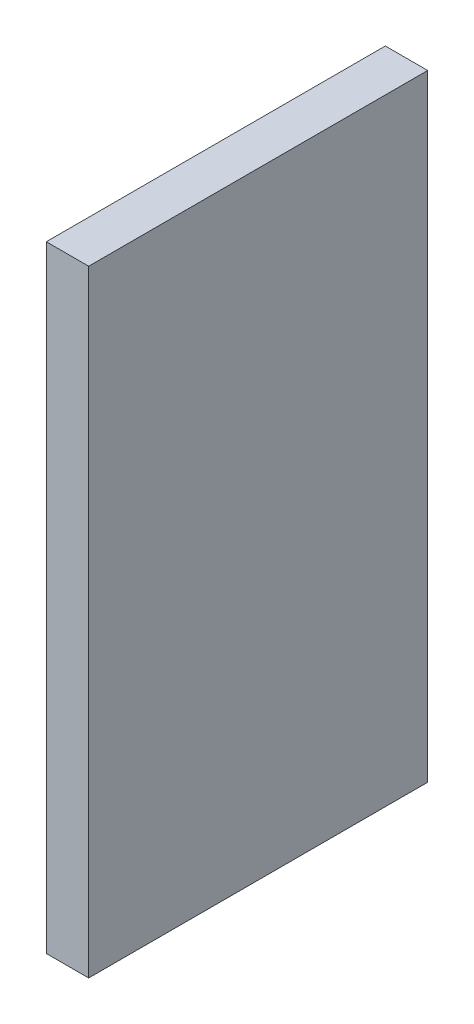
ISO-10303-21;
HEADER;
FILE_DESCRIPTION(('STEP AP214'),'2;1');
FILE_NAME('part.step','',(''),(''),'','','');
FILE_SCHEMA(('AUTOMOTIVE_DESIGN { 1 0 10303 214 1 1 1 1 }'));
ENDSEC;
DATA;
#1=APPLICATION_CONTEXT('core data for automotive mechanical design processes');
#2=APPLICATION_PROTOCOL_DEFINITION('international standard','automotive_design',2000,#1);
#3=PRODUCT_CONTEXT('',#1,'mechanical');
#4=PRODUCT('Part','Part','',(#3));
#5=PRODUCT_RELATED_PRODUCT_CATEGORY('part','',(#4));
#6=PRODUCT_DEFINITION_FORMATION('','',#4);
#7=PRODUCT_DEFINITION_CONTEXT('part definition',#1,'design');
#8=PRODUCT_DEFINITION('design','',#6,#7);
#9=PRODUCT_DEFINITION_SHAPE('','',#8);
#10=(LENGTH_UNIT() NAMED_UNIT(*) SI_UNIT(.MILLI.,.METRE.));
#11=(NAMED_UNIT(*) PLANE_ANGLE_UNIT() SI_UNIT($,.RADIAN.));
#12=(NAMED_UNIT(*) SI_UNIT($,.STERADIAN.) SOLID_ANGLE_UNIT());
#13=UNCERTAINTY_MEASURE_WITH_UNIT(LENGTH_MEASURE(1.E-05),#10,'distance_accuracy_value','');
#14=(GEOMETRIC_REPRESENTATION_CONTEXT(3) GLOBAL_UNCERTAINTY_ASSIGNED_CONTEXT((#13)) GLOBAL_UNIT_ASSIGNED_CONTEXT((#10,
#11,#12)) REPRESENTATION_CONTEXT('',''));
#15=CARTESIAN_POINT('',(0.,0.,0.));
#16=DIRECTION('',(0.,0.,1.));
#17=DIRECTION('',(1.,0.,0.));
#18=AXIS2_PLACEMENT_3D('',#15,#16,#17);
#19=CARTESIAN_POINT('',(-51.6551365597112,410.937378545825,27.94));
#20=DIRECTION('',(0.,-1.,0.));
#21=DIRECTION('',(0.,0.,-1.));
#22=AXIS2_PLACEMENT_3D('',#19,#20,#21);
#23=PLANE('',#22);
#24=DIRECTION('',(-1.,0.,0.));
#25=VECTOR('',#24,1.);
#26=CARTESIAN_POINT('',(-51.6551365597112,410.937378545825,-27.94));
#27=LINE('',#26,#25);
#28=CARTESIAN_POINT('',(-51.6551365597112,410.937378545825,-27.94));
#29=VERTEX_POINT('',#28);
#30=CARTESIAN_POINT('',(-58.6401365597111,410.937378545825,-27.94));
#31=VERTEX_POINT('',#30);
#32=EDGE_CURVE('E105',#29,#31,#27,.T.);
#33=ORIENTED_EDGE('',*,*,#32,.T.);
#34=DIRECTION('',(0.,0.,-1.));
#35=VECTOR('',#34,1.);
#36=CARTESIAN_POINT('',(-58.6401365597111,410.937378545825,27.94));
#37=LINE('',#36,#35);
#38=CARTESIAN_POINT('',(-58.6401365597111,410.937378545825,27.94));
#39=VERTEX_POINT('',#38);
#40=EDGE_CURVE('E11',#39,#31,#37,.T.);
#41=ORIENTED_EDGE('',*,*,#40,.F.);
#42=DIRECTION('',(-1.,0.,0.));
#43=VECTOR('',#42,1.);
#44=CARTESIAN_POINT('',(-51.6551365597112,410.937378545825,27.94));
#45=LINE('',#44,#43);
#46=CARTESIAN_POINT('',(-51.6551365597112,410.937378545825,27.94));
#47=VERTEX_POINT('',#46);
#48=EDGE_CURVE('E89',#47,#39,#45,.T.);
#49=ORIENTED_EDGE('',*,*,#48,.F.);
#50=DIRECTION('',(0.,0.,-1.));
#51=VECTOR('',#50,1.);
#52=CARTESIAN_POINT('',(-51.6551365597112,410.937378545825,27.94));
#53=LINE('',#52,#51);
#54=EDGE_CURVE('E98',#47,#29,#53,.T.);
#55=ORIENTED_EDGE('',*,*,#54,.T.);
#56=EDGE_LOOP('',(#33,#41,#49,#55));
#57=FACE_BOUND('',#56,.T.);
#58=ADVANCED_FACE('F39',(#57),#23,.F.);
#59=CARTESIAN_POINT('',(-58.6401365597111,410.937378545825,27.94));
#60=DIRECTION('',(1.,0.,0.));
#61=DIRECTION('',(0.,0.,-1.));
#62=AXIS2_PLACEMENT_3D('',#59,#60,#61);
#63=PLANE('',#62);
#64=DIRECTION('',(0.,-1.,0.));
#65=VECTOR('',#64,1.);
#66=CARTESIAN_POINT('',(-58.6401365597111,410.937378545825,-27.94));
#67=LINE('',#66,#65);
#68=CARTESIAN_POINT('',(-58.6401365597111,309.337378545825,-27.94));
#69=VERTEX_POINT('',#68);
#70=EDGE_CURVE('E94',#31,#69,#67,.T.);
#71=ORIENTED_EDGE('',*,*,#70,.T.);
#72=DIRECTION('',(0.,0.,-1.));
#73=VECTOR('',#72,1.);
#74=CARTESIAN_POINT('',(-58.6401365597111,309.337378545825,27.94));
#75=LINE('',#74,#73);
#76=CARTESIAN_POINT('',(-58.6401365597111,309.337378545825,27.94));
#77=VERTEX_POINT('',#76);
#78=EDGE_CURVE('E50',#77,#69,#75,.T.);
#79=ORIENTED_EDGE('',*,*,#78,.F.);
#80=DIRECTION('',(0.,-1.,0.));
#81=VECTOR('',#80,1.);
#82=CARTESIAN_POINT('',(-58.6401365597111,410.937378545825,27.94));
#83=LINE('',#82,#81);
#84=EDGE_CURVE('E84',#39,#77,#83,.T.);
#85=ORIENTED_EDGE('',*,*,#84,.F.);
#86=ORIENTED_EDGE('',*,*,#40,.T.);
#87=EDGE_LOOP('',(#71,#79,#85,#86));
#88=FACE_BOUND('',#87,.T.);
#89=ADVANCED_FACE('F91',(#88),#63,.F.);
#90=CARTESIAN_POINT('',(-51.6551365597112,309.337378545825,27.94));
#91=DIRECTION('',(0.,1.,0.));
#92=DIRECTION('',(0.,0.,1.));
#93=AXIS2_PLACEMENT_3D('',#90,#91,#92);
#94=PLANE('',#93);
#95=DIRECTION('',(1.,0.,0.));
#96=VECTOR('',#95,1.);
#97=CARTESIAN_POINT('',(-51.6551365597112,309.337378545825,-27.94));
#98=LINE('',#97,#96);
#99=CARTESIAN_POINT('',(-51.6551365597112,309.337378545825,-27.94));
#100=VERTEX_POINT('',#99);
#101=EDGE_CURVE('E75',#69,#100,#98,.T.);
#102=ORIENTED_EDGE('',*,*,#101,.T.);
#103=DIRECTION('',(0.,0.,-1.));
#104=VECTOR('',#103,1.);
#105=CARTESIAN_POINT('',(-51.6551365597112,309.337378545825,27.94));
#106=LINE('',#105,#104);
#107=CARTESIAN_POINT('',(-51.6551365597112,309.337378545825,27.94));
#108=VERTEX_POINT('',#107);
#109=EDGE_CURVE('E92',#108,#100,#106,.T.);
#110=ORIENTED_EDGE('',*,*,#109,.F.);
#111=DIRECTION('',(1.,0.,0.));
#112=VECTOR('',#111,1.);
#113=CARTESIAN_POINT('',(-51.6551365597112,309.337378545825,27.94));
#114=LINE('',#113,#112);
#115=EDGE_CURVE('E86',#77,#108,#114,.T.);
#116=ORIENTED_EDGE('',*,*,#115,.F.);
#117=ORIENTED_EDGE('',*,*,#78,.T.);
#118=EDGE_LOOP('',(#102,#110,#116,#117));
#119=FACE_BOUND('',#118,.T.);
#120=ADVANCED_FACE('F96',(#119),#94,.F.);
#121=CARTESIAN_POINT('',(-51.6551365597112,410.937378545825,27.94));
#122=DIRECTION('',(-1.,0.,0.));
#123=DIRECTION('',(0.,-1.,0.));
#124=AXIS2_PLACEMENT_3D('',#121,#122,#123);
#125=PLANE('',#124);
#126=DIRECTION('',(0.,1.,0.));
#127=VECTOR('',#126,1.);
#128=CARTESIAN_POINT('',(-51.6551365597112,410.937378545825,-27.94));
#129=LINE('',#128,#127);
#130=EDGE_CURVE('E76',#100,#29,#129,.T.);
#131=ORIENTED_EDGE('',*,*,#130,.T.);
#132=ORIENTED_EDGE('',*,*,#54,.F.);
#133=DIRECTION('',(0.,1.,0.));
#134=VECTOR('',#133,1.);
#135=CARTESIAN_POINT('',(-51.6551365597112,410.937378545825,27.94));
#136=LINE('',#135,#134);
#137=EDGE_CURVE('E54',#108,#47,#136,.T.);
#138=ORIENTED_EDGE('',*,*,#137,.F.);
#139=ORIENTED_EDGE('',*,*,#109,.T.);
#140=EDGE_LOOP('',(#131,#132,#138,#139));
#141=FACE_BOUND('',#140,.T.);
#142=ADVANCED_FACE('F108',(#141),#125,.F.);
#143=CARTESIAN_POINT('',(0.,0.,27.94));
#144=DIRECTION('',(0.,0.,1.));
#145=DIRECTION('',(1.,0.,0.));
#146=AXIS2_PLACEMENT_3D('',#143,#144,#145);
#147=PLANE('',#146);
#148=ORIENTED_EDGE('',*,*,#48,.T.);
#149=ORIENTED_EDGE('',*,*,#84,.T.);
#150=ORIENTED_EDGE('',*,*,#115,.T.);
#151=ORIENTED_EDGE('',*,*,#137,.T.);
#152=EDGE_LOOP('',(#148,#149,#150,#151));
#153=FACE_BOUND('',#152,.T.);
#154=ADVANCED_FACE('F88',(#153),#147,.T.);
#155=CARTESIAN_POINT('',(0.,0.,-27.94));
#156=DIRECTION('',(0.,0.,1.));
#157=DIRECTION('',(1.,0.,0.));
#158=AXIS2_PLACEMENT_3D('',#155,#156,#157);
#159=PLANE('',#158);
#160=ORIENTED_EDGE('',*,*,#32,.F.);
#161=ORIENTED_EDGE('',*,*,#130,.F.);
#162=ORIENTED_EDGE('',*,*,#101,.F.);
#163=ORIENTED_EDGE('',*,*,#70,.F.);
#164=EDGE_LOOP('',(#160,#161,#162,#163));
#165=FACE_BOUND('',#164,.T.);
#166=ADVANCED_FACE('F115',(#165),#159,.F.);
#167=CLOSED_SHELL('',(#58,#89,#120,#142,#154,#166));
#168=MANIFOLD_SOLID_BREP('B2',#167);
#169=ADVANCED_BREP_SHAPE_REPRESENTATION('',(#18,#168),#14);
#170=SHAPE_DEFINITION_REPRESENTATION(#9,#169);
ENDSEC;
END-ISO-10303-21;
